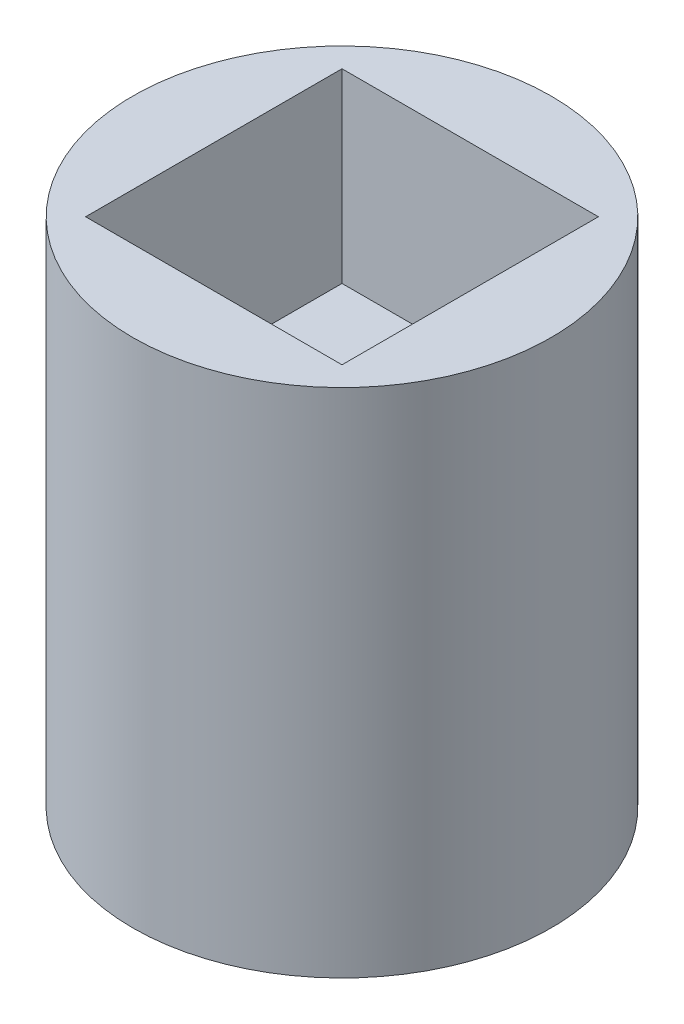
ISO-10303-21;
HEADER;
FILE_DESCRIPTION(('STEP AP214'),'2;1');
FILE_NAME('part.step','',(''),(''),'','','');
FILE_SCHEMA(('AUTOMOTIVE_DESIGN { 1 0 10303 214 1 1 1 1 }'));
ENDSEC;
DATA;
#1=APPLICATION_CONTEXT('core data for automotive mechanical design processes');
#2=APPLICATION_PROTOCOL_DEFINITION('international standard','automotive_design',2000,#1);
#3=PRODUCT_CONTEXT('',#1,'mechanical');
#4=PRODUCT('Part','Part','',(#3));
#5=PRODUCT_RELATED_PRODUCT_CATEGORY('part','',(#4));
#6=PRODUCT_DEFINITION_FORMATION('','',#4);
#7=PRODUCT_DEFINITION_CONTEXT('part definition',#1,'design');
#8=PRODUCT_DEFINITION('design','',#6,#7);
#9=PRODUCT_DEFINITION_SHAPE('','',#8);
#10=(LENGTH_UNIT() NAMED_UNIT(*) SI_UNIT(.MILLI.,.METRE.));
#11=(NAMED_UNIT(*) PLANE_ANGLE_UNIT() SI_UNIT($,.RADIAN.));
#12=(NAMED_UNIT(*) SI_UNIT($,.STERADIAN.) SOLID_ANGLE_UNIT());
#13=UNCERTAINTY_MEASURE_WITH_UNIT(LENGTH_MEASURE(1.E-05),#10,'distance_accuracy_value','');
#14=(GEOMETRIC_REPRESENTATION_CONTEXT(3) GLOBAL_UNCERTAINTY_ASSIGNED_CONTEXT((#13)) GLOBAL_UNIT_ASSIGNED_CONTEXT((#10,
#11,#12)) REPRESENTATION_CONTEXT('',''));
#15=CARTESIAN_POINT('',(0.,0.,0.));
#16=DIRECTION('',(0.,0.,1.));
#17=DIRECTION('',(1.,0.,0.));
#18=AXIS2_PLACEMENT_3D('',#15,#16,#17);
#19=CARTESIAN_POINT('',(0.,-13.75,0.));
#20=DIRECTION('',(0.,1.,0.));
#21=DIRECTION('',(0.,0.,1.));
#22=AXIS2_PLACEMENT_3D('',#19,#20,#21);
#23=PLANE('',#22);
#24=CARTESIAN_POINT('',(0.,-13.75,0.));
#25=DIRECTION('',(0.,1.,0.));
#26=DIRECTION('',(0.,0.,1.));
#27=AXIS2_PLACEMENT_3D('',#24,#25,#26);
#28=CIRCLE('',#27,11.25);
#29=CARTESIAN_POINT('',(0.,-13.75,11.25));
#30=VERTEX_POINT('',#29);
#31=EDGE_CURVE('E43',#30,#30,#28,.T.);
#32=ORIENTED_EDGE('',*,*,#31,.F.);
#33=EDGE_LOOP('',(#32));
#34=FACE_BOUND('',#33,.T.);
#35=DIRECTION('',(0.,0.,-1.));
#36=VECTOR('',#35,1.);
#37=CARTESIAN_POINT('',(6.89429111656884,-13.75,-6.89429111656884));
#38=LINE('',#37,#36);
#39=CARTESIAN_POINT('',(6.89429111656884,-13.75,6.89429111656884));
#40=VERTEX_POINT('',#39);
#41=CARTESIAN_POINT('',(6.89429111656884,-13.75,-6.89429111656884));
#42=VERTEX_POINT('',#41);
#43=EDGE_CURVE('E54',#40,#42,#38,.T.);
#44=ORIENTED_EDGE('',*,*,#43,.T.);
#45=DIRECTION('',(-1.,0.,0.));
#46=VECTOR('',#45,1.);
#47=CARTESIAN_POINT('',(-6.89429111656884,-13.75,-6.89429111656884));
#48=LINE('',#47,#46);
#49=CARTESIAN_POINT('',(-6.89429111656884,-13.75,-6.89429111656884));
#50=VERTEX_POINT('',#49);
#51=EDGE_CURVE('E124',#42,#50,#48,.T.);
#52=ORIENTED_EDGE('',*,*,#51,.T.);
#53=DIRECTION('',(0.,0.,1.));
#54=VECTOR('',#53,1.);
#55=CARTESIAN_POINT('',(-6.89429111656884,-13.75,-6.89429111656884));
#56=LINE('',#55,#54);
#57=CARTESIAN_POINT('',(-6.89429111656884,-13.75,6.89429111656884));
#58=VERTEX_POINT('',#57);
#59=EDGE_CURVE('E127',#50,#58,#56,.T.);
#60=ORIENTED_EDGE('',*,*,#59,.T.);
#61=DIRECTION('',(1.,0.,0.));
#62=VECTOR('',#61,1.);
#63=CARTESIAN_POINT('',(-6.89429111656884,-13.75,6.89429111656884));
#64=LINE('',#63,#62);
#65=EDGE_CURVE('E133',#58,#40,#64,.T.);
#66=ORIENTED_EDGE('',*,*,#65,.T.);
#67=EDGE_LOOP('',(#44,#52,#60,#66));
#68=FACE_BOUND('',#67,.T.);
#69=ADVANCED_FACE('F39',(#34,#68),#23,.F.);
#70=CARTESIAN_POINT('',(0.,13.75,0.));
#71=DIRECTION('',(0.,-1.,0.));
#72=DIRECTION('',(0.,0.,-1.));
#73=AXIS2_PLACEMENT_3D('',#70,#71,#72);
#74=CYLINDRICAL_SURFACE('',#73,11.25);
#75=CARTESIAN_POINT('',(0.,13.75,0.));
#76=DIRECTION('',(0.,1.,0.));
#77=DIRECTION('',(0.,0.,1.));
#78=AXIS2_PLACEMENT_3D('',#75,#76,#77);
#79=CIRCLE('',#78,11.25);
#80=CARTESIAN_POINT('',(0.,13.75,11.25));
#81=VERTEX_POINT('',#80);
#82=EDGE_CURVE('E11',#81,#81,#79,.T.);
#83=ORIENTED_EDGE('',*,*,#82,.F.);
#84=EDGE_LOOP('',(#83));
#85=FACE_BOUND('',#84,.T.);
#86=ORIENTED_EDGE('',*,*,#31,.T.);
#87=EDGE_LOOP('',(#86));
#88=FACE_BOUND('',#87,.T.);
#89=ADVANCED_FACE('F41',(#85,#88),#74,.T.);
#90=CARTESIAN_POINT('',(0.,13.75,0.));
#91=DIRECTION('',(0.,1.,0.));
#92=DIRECTION('',(0.,0.,1.));
#93=AXIS2_PLACEMENT_3D('',#90,#91,#92);
#94=PLANE('',#93);
#95=DIRECTION('',(0.,0.,-1.));
#96=VECTOR('',#95,1.);
#97=CARTESIAN_POINT('',(6.89429111656884,13.75,-6.89429111656884));
#98=LINE('',#97,#96);
#99=CARTESIAN_POINT('',(6.89429111656884,13.75,6.89429111656884));
#100=VERTEX_POINT('',#99);
#101=CARTESIAN_POINT('',(6.89429111656884,13.75,-6.89429111656884));
#102=VERTEX_POINT('',#101);
#103=EDGE_CURVE('E62',#100,#102,#98,.T.);
#104=ORIENTED_EDGE('',*,*,#103,.F.);
#105=DIRECTION('',(1.,0.,0.));
#106=VECTOR('',#105,1.);
#107=CARTESIAN_POINT('',(-6.89429111656884,13.75,6.89429111656884));
#108=LINE('',#107,#106);
#109=CARTESIAN_POINT('',(-6.89429111656884,13.75,6.89429111656884));
#110=VERTEX_POINT('',#109);
#111=EDGE_CURVE('E146',#110,#100,#108,.T.);
#112=ORIENTED_EDGE('',*,*,#111,.F.);
#113=DIRECTION('',(0.,0.,1.));
#114=VECTOR('',#113,1.);
#115=CARTESIAN_POINT('',(-6.89429111656884,13.75,-6.89429111656884));
#116=LINE('',#115,#114);
#117=CARTESIAN_POINT('',(-6.89429111656884,13.75,-6.89429111656884));
#118=VERTEX_POINT('',#117);
#119=EDGE_CURVE('E160',#118,#110,#116,.T.);
#120=ORIENTED_EDGE('',*,*,#119,.F.);
#121=DIRECTION('',(-1.,0.,0.));
#122=VECTOR('',#121,1.);
#123=CARTESIAN_POINT('',(-6.89429111656884,13.75,-6.89429111656884));
#124=LINE('',#123,#122);
#125=EDGE_CURVE('E157',#102,#118,#124,.T.);
#126=ORIENTED_EDGE('',*,*,#125,.F.);
#127=EDGE_LOOP('',(#104,#112,#120,#126));
#128=FACE_BOUND('',#127,.T.);
#129=ORIENTED_EDGE('',*,*,#82,.T.);
#130=EDGE_LOOP('',(#129));
#131=FACE_BOUND('',#130,.T.);
#132=ADVANCED_FACE('F178',(#128,#131),#94,.T.);
#133=CARTESIAN_POINT('',(6.89429111656884,3.75,-6.89429111656884));
#134=DIRECTION('',(1.,0.,0.));
#135=DIRECTION('',(0.,0.,-1.));
#136=AXIS2_PLACEMENT_3D('',#133,#134,#135);
#137=PLANE('',#136);
#138=ORIENTED_EDGE('',*,*,#103,.T.);
#139=DIRECTION('',(0.,1.,0.));
#140=VECTOR('',#139,1.);
#141=CARTESIAN_POINT('',(6.89429111656884,3.75,-6.89429111656884));
#142=LINE('',#141,#140);
#143=CARTESIAN_POINT('',(6.89429111656884,3.75,-6.89429111656884));
#144=VERTEX_POINT('',#143);
#145=EDGE_CURVE('E155',#144,#102,#142,.T.);
#146=ORIENTED_EDGE('',*,*,#145,.F.);
#147=DIRECTION('',(0.,0.,-1.));
#148=VECTOR('',#147,1.);
#149=CARTESIAN_POINT('',(6.89429111656884,3.75,-6.89429111656884));
#150=LINE('',#149,#148);
#151=CARTESIAN_POINT('',(6.89429111656884,3.75,6.89429111656884));
#152=VERTEX_POINT('',#151);
#153=EDGE_CURVE('E142',#152,#144,#150,.T.);
#154=ORIENTED_EDGE('',*,*,#153,.F.);
#155=DIRECTION('',(0.,1.,0.));
#156=VECTOR('',#155,1.);
#157=CARTESIAN_POINT('',(6.89429111656884,3.75,6.89429111656884));
#158=LINE('',#157,#156);
#159=EDGE_CURVE('E165',#152,#100,#158,.T.);
#160=ORIENTED_EDGE('',*,*,#159,.T.);
#161=EDGE_LOOP('',(#138,#146,#154,#160));
#162=FACE_BOUND('',#161,.T.);
#163=ADVANCED_FACE('F187',(#162),#137,.F.);
#164=CARTESIAN_POINT('',(-6.89429111656884,3.75,6.89429111656884));
#165=DIRECTION('',(0.,0.,1.));
#166=DIRECTION('',(1.,0.,0.));
#167=AXIS2_PLACEMENT_3D('',#164,#165,#166);
#168=PLANE('',#167);
#169=ORIENTED_EDGE('',*,*,#111,.T.);
#170=ORIENTED_EDGE('',*,*,#159,.F.);
#171=DIRECTION('',(1.,0.,0.));
#172=VECTOR('',#171,1.);
#173=CARTESIAN_POINT('',(-6.89429111656884,3.75,6.89429111656884));
#174=LINE('',#173,#172);
#175=CARTESIAN_POINT('',(-6.89429111656884,3.75,6.89429111656884));
#176=VERTEX_POINT('',#175);
#177=EDGE_CURVE('E152',#176,#152,#174,.T.);
#178=ORIENTED_EDGE('',*,*,#177,.F.);
#179=DIRECTION('',(0.,1.,0.));
#180=VECTOR('',#179,1.);
#181=CARTESIAN_POINT('',(-6.89429111656884,3.75,6.89429111656884));
#182=LINE('',#181,#180);
#183=EDGE_CURVE('E167',#176,#110,#182,.T.);
#184=ORIENTED_EDGE('',*,*,#183,.T.);
#185=EDGE_LOOP('',(#169,#170,#178,#184));
#186=FACE_BOUND('',#185,.T.);
#187=ADVANCED_FACE('F189',(#186),#168,.F.);
#188=CARTESIAN_POINT('',(-6.89429111656884,3.75,-6.89429111656884));
#189=DIRECTION('',(-1.,0.,0.));
#190=DIRECTION('',(0.,0.,1.));
#191=AXIS2_PLACEMENT_3D('',#188,#189,#190);
#192=PLANE('',#191);
#193=ORIENTED_EDGE('',*,*,#119,.T.);
#194=ORIENTED_EDGE('',*,*,#183,.F.);
#195=DIRECTION('',(0.,0.,1.));
#196=VECTOR('',#195,1.);
#197=CARTESIAN_POINT('',(-6.89429111656884,3.75,-6.89429111656884));
#198=LINE('',#197,#196);
#199=CARTESIAN_POINT('',(-6.89429111656884,3.75,-6.89429111656884));
#200=VERTEX_POINT('',#199);
#201=EDGE_CURVE('E149',#200,#176,#198,.T.);
#202=ORIENTED_EDGE('',*,*,#201,.F.);
#203=DIRECTION('',(0.,1.,0.));
#204=VECTOR('',#203,1.);
#205=CARTESIAN_POINT('',(-6.89429111656884,3.75,-6.89429111656884));
#206=LINE('',#205,#204);
#207=EDGE_CURVE('E169',#200,#118,#206,.T.);
#208=ORIENTED_EDGE('',*,*,#207,.T.);
#209=EDGE_LOOP('',(#193,#194,#202,#208));
#210=FACE_BOUND('',#209,.T.);
#211=ADVANCED_FACE('F182',(#210),#192,.F.);
#212=CARTESIAN_POINT('',(-6.89429111656884,3.75,-6.89429111656884));
#213=DIRECTION('',(0.,0.,-1.));
#214=DIRECTION('',(-1.,0.,0.));
#215=AXIS2_PLACEMENT_3D('',#212,#213,#214);
#216=PLANE('',#215);
#217=ORIENTED_EDGE('',*,*,#125,.T.);
#218=ORIENTED_EDGE('',*,*,#207,.F.);
#219=DIRECTION('',(-1.,0.,0.));
#220=VECTOR('',#219,1.);
#221=CARTESIAN_POINT('',(-6.89429111656884,3.75,-6.89429111656884));
#222=LINE('',#221,#220);
#223=EDGE_CURVE('E145',#144,#200,#222,.T.);
#224=ORIENTED_EDGE('',*,*,#223,.F.);
#225=ORIENTED_EDGE('',*,*,#145,.T.);
#226=EDGE_LOOP('',(#217,#218,#224,#225));
#227=FACE_BOUND('',#226,.T.);
#228=ADVANCED_FACE('F174',(#227),#216,.F.);
#229=CARTESIAN_POINT('',(0.,3.75,0.));
#230=DIRECTION('',(0.,1.,0.));
#231=DIRECTION('',(0.,0.,1.));
#232=AXIS2_PLACEMENT_3D('',#229,#230,#231);
#233=PLANE('',#232);
#234=ORIENTED_EDGE('',*,*,#153,.T.);
#235=ORIENTED_EDGE('',*,*,#223,.T.);
#236=ORIENTED_EDGE('',*,*,#201,.T.);
#237=ORIENTED_EDGE('',*,*,#177,.T.);
#238=EDGE_LOOP('',(#234,#235,#236,#237));
#239=FACE_BOUND('',#238,.T.);
#240=ADVANCED_FACE('F186',(#239),#233,.T.);
#241=CARTESIAN_POINT('',(6.89429111656884,-3.75,-6.89429111656884));
#242=DIRECTION('',(-1.,0.,0.));
#243=DIRECTION('',(0.,0.,1.));
#244=AXIS2_PLACEMENT_3D('',#241,#242,#243);
#245=PLANE('',#244);
#246=ORIENTED_EDGE('',*,*,#43,.F.);
#247=DIRECTION('',(0.,-1.,0.));
#248=VECTOR('',#247,1.);
#249=CARTESIAN_POINT('',(6.89429111656884,-3.75,6.89429111656884));
#250=LINE('',#249,#248);
#251=CARTESIAN_POINT('',(6.89429111656884,-3.75,6.89429111656884));
#252=VERTEX_POINT('',#251);
#253=EDGE_CURVE('E109',#252,#40,#250,.T.);
#254=ORIENTED_EDGE('',*,*,#253,.F.);
#255=DIRECTION('',(0.,0.,-1.));
#256=VECTOR('',#255,1.);
#257=CARTESIAN_POINT('',(6.89429111656884,-3.75,-6.89429111656884));
#258=LINE('',#257,#256);
#259=CARTESIAN_POINT('',(6.89429111656884,-3.75,-6.89429111656884));
#260=VERTEX_POINT('',#259);
#261=EDGE_CURVE('E116',#252,#260,#258,.T.);
#262=ORIENTED_EDGE('',*,*,#261,.T.);
#263=DIRECTION('',(0.,-1.,0.));
#264=VECTOR('',#263,1.);
#265=CARTESIAN_POINT('',(6.89429111656884,-3.75,-6.89429111656884));
#266=LINE('',#265,#264);
#267=EDGE_CURVE('E137',#260,#42,#266,.T.);
#268=ORIENTED_EDGE('',*,*,#267,.T.);
#269=EDGE_LOOP('',(#246,#254,#262,#268));
#270=FACE_BOUND('',#269,.T.);
#271=ADVANCED_FACE('F119',(#270),#245,.T.);
#272=CARTESIAN_POINT('',(-6.89429111656884,-3.75,-6.89429111656884));
#273=DIRECTION('',(0.,0.,1.));
#274=DIRECTION('',(1.,0.,0.));
#275=AXIS2_PLACEMENT_3D('',#272,#273,#274);
#276=PLANE('',#275);
#277=ORIENTED_EDGE('',*,*,#51,.F.);
#278=ORIENTED_EDGE('',*,*,#267,.F.);
#279=DIRECTION('',(-1.,0.,0.));
#280=VECTOR('',#279,1.);
#281=CARTESIAN_POINT('',(-6.89429111656884,-3.75,-6.89429111656884));
#282=LINE('',#281,#280);
#283=CARTESIAN_POINT('',(-6.89429111656884,-3.75,-6.89429111656884));
#284=VERTEX_POINT('',#283);
#285=EDGE_CURVE('E121',#260,#284,#282,.T.);
#286=ORIENTED_EDGE('',*,*,#285,.T.);
#287=DIRECTION('',(0.,-1.,0.));
#288=VECTOR('',#287,1.);
#289=CARTESIAN_POINT('',(-6.89429111656884,-3.75,-6.89429111656884));
#290=LINE('',#289,#288);
#291=EDGE_CURVE('E139',#284,#50,#290,.T.);
#292=ORIENTED_EDGE('',*,*,#291,.T.);
#293=EDGE_LOOP('',(#277,#278,#286,#292));
#294=FACE_BOUND('',#293,.T.);
#295=ADVANCED_FACE('F217',(#294),#276,.T.);
#296=CARTESIAN_POINT('',(-6.89429111656884,-3.75,-6.89429111656884));
#297=DIRECTION('',(1.,0.,0.));
#298=DIRECTION('',(0.,0.,-1.));
#299=AXIS2_PLACEMENT_3D('',#296,#297,#298);
#300=PLANE('',#299);
#301=ORIENTED_EDGE('',*,*,#59,.F.);
#302=ORIENTED_EDGE('',*,*,#291,.F.);
#303=DIRECTION('',(0.,0.,1.));
#304=VECTOR('',#303,1.);
#305=CARTESIAN_POINT('',(-6.89429111656884,-3.75,-6.89429111656884));
#306=LINE('',#305,#304);
#307=CARTESIAN_POINT('',(-6.89429111656884,-3.75,6.89429111656884));
#308=VERTEX_POINT('',#307);
#309=EDGE_CURVE('E115',#284,#308,#306,.T.);
#310=ORIENTED_EDGE('',*,*,#309,.T.);
#311=DIRECTION('',(0.,-1.,0.));
#312=VECTOR('',#311,1.);
#313=CARTESIAN_POINT('',(-6.89429111656884,-3.75,6.89429111656884));
#314=LINE('',#313,#312);
#315=EDGE_CURVE('E111',#308,#58,#314,.T.);
#316=ORIENTED_EDGE('',*,*,#315,.T.);
#317=EDGE_LOOP('',(#301,#302,#310,#316));
#318=FACE_BOUND('',#317,.T.);
#319=ADVANCED_FACE('F222',(#318),#300,.T.);
#320=CARTESIAN_POINT('',(-6.89429111656884,-3.75,6.89429111656884));
#321=DIRECTION('',(0.,0.,-1.));
#322=DIRECTION('',(-1.,0.,0.));
#323=AXIS2_PLACEMENT_3D('',#320,#321,#322);
#324=PLANE('',#323);
#325=ORIENTED_EDGE('',*,*,#65,.F.);
#326=ORIENTED_EDGE('',*,*,#315,.F.);
#327=DIRECTION('',(1.,0.,0.));
#328=VECTOR('',#327,1.);
#329=CARTESIAN_POINT('',(-6.89429111656884,-3.75,6.89429111656884));
#330=LINE('',#329,#328);
#331=EDGE_CURVE('E106',#308,#252,#330,.T.);
#332=ORIENTED_EDGE('',*,*,#331,.T.);
#333=ORIENTED_EDGE('',*,*,#253,.T.);
#334=EDGE_LOOP('',(#325,#326,#332,#333));
#335=FACE_BOUND('',#334,.T.);
#336=ADVANCED_FACE('F108',(#335),#324,.T.);
#337=CARTESIAN_POINT('',(0.,-3.75,0.));
#338=DIRECTION('',(0.,-1.,0.));
#339=DIRECTION('',(0.,0.,1.));
#340=AXIS2_PLACEMENT_3D('',#337,#338,#339);
#341=PLANE('',#340);
#342=ORIENTED_EDGE('',*,*,#261,.F.);
#343=ORIENTED_EDGE('',*,*,#331,.F.);
#344=ORIENTED_EDGE('',*,*,#309,.F.);
#345=ORIENTED_EDGE('',*,*,#285,.F.);
#346=EDGE_LOOP('',(#342,#343,#344,#345));
#347=FACE_BOUND('',#346,.T.);
#348=ADVANCED_FACE('F123',(#347),#341,.T.);
#349=CLOSED_SHELL('',(#69,#89,#132,#163,#187,#211,#228,#240,#271,#295,#319,#336,#348));
#350=MANIFOLD_SOLID_BREP('B2',#349);
#351=ADVANCED_BREP_SHAPE_REPRESENTATION('',(#18,#350),#14);
#352=SHAPE_DEFINITION_REPRESENTATION(#9,#351);
ENDSEC;
END-ISO-10303-21;
